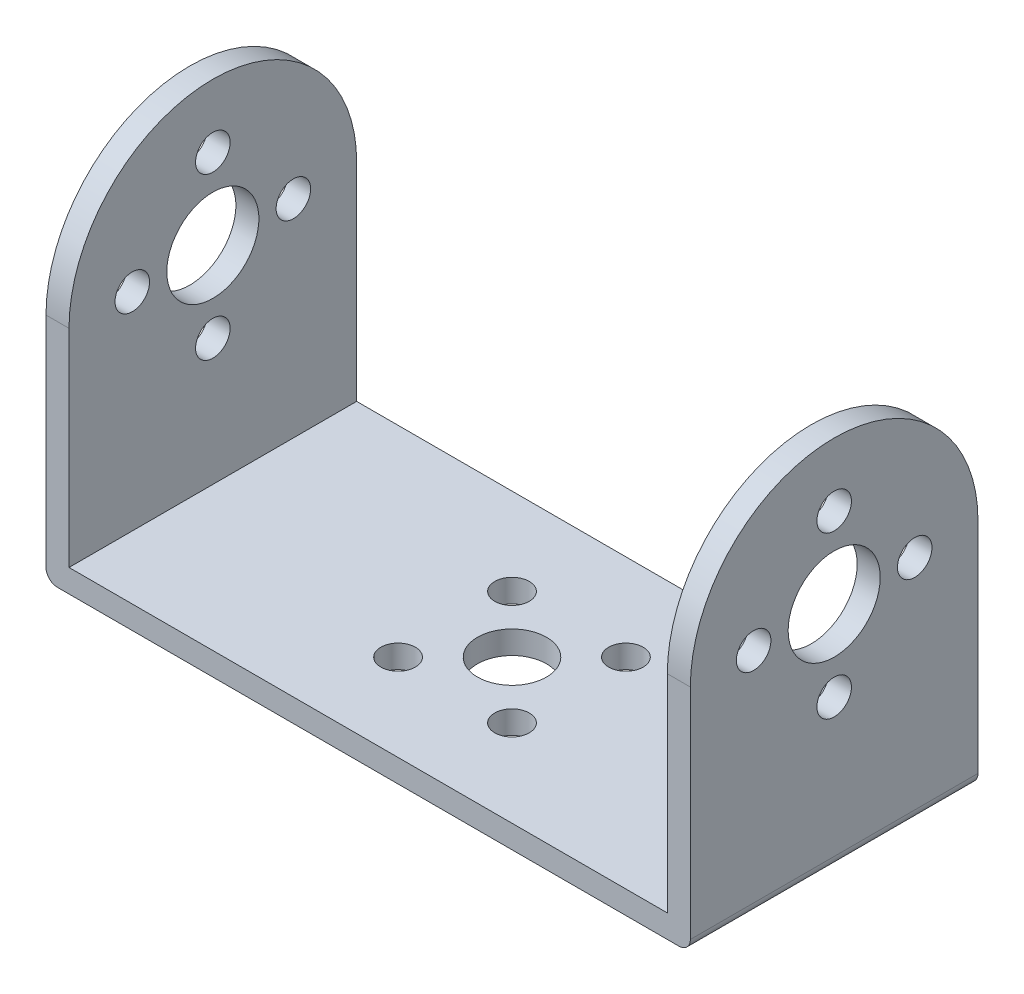
ISO-10303-21;
HEADER;
FILE_DESCRIPTION(('STEP AP214'),'2;1');
FILE_NAME('part.step','',(''),(''),'','','');
FILE_SCHEMA(('AUTOMOTIVE_DESIGN { 1 0 10303 214 1 1 1 1 }'));
ENDSEC;
DATA;
#1=APPLICATION_CONTEXT('core data for automotive mechanical design processes');
#2=APPLICATION_PROTOCOL_DEFINITION('international standard','automotive_design',2000,#1);
#3=PRODUCT_CONTEXT('',#1,'mechanical');
#4=PRODUCT('Part','Part','',(#3));
#5=PRODUCT_RELATED_PRODUCT_CATEGORY('part','',(#4));
#6=PRODUCT_DEFINITION_FORMATION('','',#4);
#7=PRODUCT_DEFINITION_CONTEXT('part definition',#1,'design');
#8=PRODUCT_DEFINITION('design','',#6,#7);
#9=PRODUCT_DEFINITION_SHAPE('','',#8);
#10=(LENGTH_UNIT() NAMED_UNIT(*) SI_UNIT(.MILLI.,.METRE.));
#11=(NAMED_UNIT(*) PLANE_ANGLE_UNIT() SI_UNIT($,.RADIAN.));
#12=(NAMED_UNIT(*) SI_UNIT($,.STERADIAN.) SOLID_ANGLE_UNIT());
#13=UNCERTAINTY_MEASURE_WITH_UNIT(LENGTH_MEASURE(1.E-05),#10,'distance_accuracy_value','');
#14=(GEOMETRIC_REPRESENTATION_CONTEXT(3) GLOBAL_UNCERTAINTY_ASSIGNED_CONTEXT((#13)) GLOBAL_UNIT_ASSIGNED_CONTEXT((#10,
#11,#12)) REPRESENTATION_CONTEXT('',''));
#15=CARTESIAN_POINT('',(0.,0.,0.));
#16=DIRECTION('',(0.,0.,1.));
#17=DIRECTION('',(1.,0.,0.));
#18=AXIS2_PLACEMENT_3D('',#15,#16,#17);
#19=CARTESIAN_POINT('',(0.,2.,0.));
#20=DIRECTION('',(0.,1.,0.));
#21=DIRECTION('',(0.,0.,1.));
#22=AXIS2_PLACEMENT_3D('',#19,#20,#21);
#23=PLANE('',#22);
#24=CARTESIAN_POINT('',(12.6040027874548,2.,-5.68113044702918));
#25=DIRECTION('',(0.,1.,0.));
#26=DIRECTION('',(0.,0.,1.));
#27=AXIS2_PLACEMENT_3D('',#24,#25,#26);
#28=CIRCLE('',#27,1.5);
#29=CARTESIAN_POINT('',(12.6040027874548,2.,-4.18113044702918));
#30=VERTEX_POINT('',#29);
#31=EDGE_CURVE('E241',#30,#30,#28,.T.);
#32=ORIENTED_EDGE('',*,*,#31,.F.);
#33=EDGE_LOOP('',(#32));
#34=FACE_BOUND('',#33,.T.);
#35=CARTESIAN_POINT('',(2.70450785084305,2.,-5.68113044702918));
#36=DIRECTION('',(0.,1.,0.));
#37=DIRECTION('',(0.,0.,1.));
#38=AXIS2_PLACEMENT_3D('',#35,#36,#37);
#39=CIRCLE('',#38,1.5);
#40=CARTESIAN_POINT('',(2.70450785084305,2.,-4.18113044702918));
#41=VERTEX_POINT('',#40);
#42=EDGE_CURVE('E249',#41,#41,#39,.T.);
#43=ORIENTED_EDGE('',*,*,#42,.F.);
#44=EDGE_LOOP('',(#43));
#45=FACE_BOUND('',#44,.T.);
#46=CARTESIAN_POINT('',(12.6040027874548,2.,4.21836448958237));
#47=DIRECTION('',(0.,1.,0.));
#48=DIRECTION('',(0.,0.,1.));
#49=AXIS2_PLACEMENT_3D('',#46,#47,#48);
#50=CIRCLE('',#49,1.5);
#51=CARTESIAN_POINT('',(12.6040027874548,2.,5.71836448958237));
#52=VERTEX_POINT('',#51);
#53=EDGE_CURVE('E257',#52,#52,#50,.T.);
#54=ORIENTED_EDGE('',*,*,#53,.F.);
#55=EDGE_LOOP('',(#54));
#56=FACE_BOUND('',#55,.T.);
#57=CARTESIAN_POINT('',(2.70450785084305,2.,4.21836448958237));
#58=DIRECTION('',(0.,1.,0.));
#59=DIRECTION('',(0.,0.,1.));
#60=AXIS2_PLACEMENT_3D('',#57,#58,#59);
#61=CIRCLE('',#60,1.5);
#62=CARTESIAN_POINT('',(2.70450785084305,2.,5.71836448958237));
#63=VERTEX_POINT('',#62);
#64=EDGE_CURVE('E232',#63,#63,#61,.T.);
#65=ORIENTED_EDGE('',*,*,#64,.F.);
#66=EDGE_LOOP('',(#65));
#67=FACE_BOUND('',#66,.T.);
#68=CARTESIAN_POINT('',(7.65425531914894,2.,-0.731382978723405));
#69=DIRECTION('',(0.,1.,0.));
#70=DIRECTION('',(0.,0.,1.));
#71=AXIS2_PLACEMENT_3D('',#68,#69,#70);
#72=CIRCLE('',#71,3.);
#73=CARTESIAN_POINT('',(7.65425531914894,2.,2.2686170212766));
#74=VERTEX_POINT('',#73);
#75=EDGE_CURVE('E240',#74,#74,#72,.T.);
#76=ORIENTED_EDGE('',*,*,#75,.F.);
#77=EDGE_LOOP('',(#76));
#78=FACE_BOUND('',#77,.T.);
#79=DIRECTION('',(1.,0.,0.));
#80=VECTOR('',#79,1.);
#81=CARTESIAN_POINT('',(-20.3457446808511,2.,11.7686170212766));
#82=LINE('',#81,#80);
#83=CARTESIAN_POINT('',(-18.3457446808511,2.,11.7686170212766));
#84=VERTEX_POINT('',#83);
#85=CARTESIAN_POINT('',(33.6542553191489,2.,11.7686170212766));
#86=VERTEX_POINT('',#85);
#87=EDGE_CURVE('E276',#84,#86,#82,.T.);
#88=ORIENTED_EDGE('',*,*,#87,.T.);
#89=DIRECTION('',(0.,0.,1.));
#90=VECTOR('',#89,1.);
#91=CARTESIAN_POINT('',(33.6542553191489,2.,-13.2313829787234));
#92=LINE('',#91,#90);
#93=CARTESIAN_POINT('',(33.6542553191489,2.,-13.2313829787234));
#94=VERTEX_POINT('',#93);
#95=EDGE_CURVE('E132',#94,#86,#92,.T.);
#96=ORIENTED_EDGE('',*,*,#95,.F.);
#97=DIRECTION('',(-1.,0.,0.));
#98=VECTOR('',#97,1.);
#99=CARTESIAN_POINT('',(-20.3457446808511,2.,-13.2313829787234));
#100=LINE('',#99,#98);
#101=CARTESIAN_POINT('',(-18.3457446808511,2.,-13.2313829787234));
#102=VERTEX_POINT('',#101);
#103=EDGE_CURVE('E279',#94,#102,#100,.T.);
#104=ORIENTED_EDGE('',*,*,#103,.T.);
#105=DIRECTION('',(0.,0.,1.));
#106=VECTOR('',#105,1.);
#107=CARTESIAN_POINT('',(-18.3457446808511,2.,-13.2313829787234));
#108=LINE('',#107,#106);
#109=EDGE_CURVE('E216',#102,#84,#108,.T.);
#110=ORIENTED_EDGE('',*,*,#109,.T.);
#111=EDGE_LOOP('',(#88,#96,#104,#110));
#112=FACE_BOUND('',#111,.T.);
#113=ADVANCED_FACE('F43',(#34,#45,#56,#67,#78,#112),#23,.T.);
#114=CARTESIAN_POINT('',(-20.3457446808511,2.,-13.2313829787234));
#115=DIRECTION('',(1.,0.,0.));
#116=DIRECTION('',(0.,0.,-1.));
#117=AXIS2_PLACEMENT_3D('',#114,#115,#116);
#118=PLANE('',#117);
#119=CARTESIAN_POINT('',(-20.3457446808511,20.,-7.73138297872341));
#120=DIRECTION('',(-1.,0.,0.));
#121=DIRECTION('',(0.,0.,1.));
#122=AXIS2_PLACEMENT_3D('',#119,#120,#121);
#123=CIRCLE('',#122,1.5);
#124=CARTESIAN_POINT('',(-20.3457446808511,20.,-6.23138297872341));
#125=VERTEX_POINT('',#124);
#126=EDGE_CURVE('E166',#125,#125,#123,.T.);
#127=ORIENTED_EDGE('',*,*,#126,.F.);
#128=EDGE_LOOP('',(#127));
#129=FACE_BOUND('',#128,.T.);
#130=CARTESIAN_POINT('',(-20.3457446808511,13.,-0.731382978723408));
#131=DIRECTION('',(-1.,0.,0.));
#132=DIRECTION('',(0.,0.,1.));
#133=AXIS2_PLACEMENT_3D('',#130,#131,#132);
#134=CIRCLE('',#133,1.5);
#135=CARTESIAN_POINT('',(-20.3457446808511,13.,0.76861702127659));
#136=VERTEX_POINT('',#135);
#137=EDGE_CURVE('E168',#136,#136,#134,.T.);
#138=ORIENTED_EDGE('',*,*,#137,.F.);
#139=EDGE_LOOP('',(#138));
#140=FACE_BOUND('',#139,.T.);
#141=CARTESIAN_POINT('',(-20.3457446808511,20.,6.26861702127659));
#142=DIRECTION('',(-1.,0.,0.));
#143=DIRECTION('',(0.,0.,1.));
#144=AXIS2_PLACEMENT_3D('',#141,#142,#143);
#145=CIRCLE('',#144,1.5);
#146=CARTESIAN_POINT('',(-20.3457446808511,20.,7.76861702127659));
#147=VERTEX_POINT('',#146);
#148=EDGE_CURVE('E177',#147,#147,#145,.T.);
#149=ORIENTED_EDGE('',*,*,#148,.F.);
#150=EDGE_LOOP('',(#149));
#151=FACE_BOUND('',#150,.T.);
#152=CARTESIAN_POINT('',(-20.3457446808511,27.,-0.731382978723409));
#153=DIRECTION('',(-1.,0.,0.));
#154=DIRECTION('',(0.,0.,1.));
#155=AXIS2_PLACEMENT_3D('',#152,#153,#154);
#156=CIRCLE('',#155,1.5);
#157=CARTESIAN_POINT('',(-20.3457446808511,27.,0.768617021276593));
#158=VERTEX_POINT('',#157);
#159=EDGE_CURVE('E184',#158,#158,#156,.T.);
#160=ORIENTED_EDGE('',*,*,#159,.F.);
#161=EDGE_LOOP('',(#160));
#162=FACE_BOUND('',#161,.T.);
#163=CARTESIAN_POINT('',(-20.3457446808511,20.,-0.731382978723409));
#164=DIRECTION('',(-1.,0.,0.));
#165=DIRECTION('',(0.,0.,1.));
#166=AXIS2_PLACEMENT_3D('',#163,#164,#165);
#167=CIRCLE('',#166,4.);
#168=CARTESIAN_POINT('',(-20.3457446808511,20.,3.26861702127659));
#169=VERTEX_POINT('',#168);
#170=EDGE_CURVE('E193',#169,#169,#167,.T.);
#171=ORIENTED_EDGE('',*,*,#170,.F.);
#172=EDGE_LOOP('',(#171));
#173=FACE_BOUND('',#172,.T.);
#174=DIRECTION('',(0.,-1.,0.));
#175=VECTOR('',#174,1.);
#176=CARTESIAN_POINT('',(-20.3457446808511,2.,-13.2313829787234));
#177=LINE('',#176,#175);
#178=CARTESIAN_POINT('',(-20.3457446808511,20.,-13.2313829787234));
#179=VERTEX_POINT('',#178);
#180=CARTESIAN_POINT('',(-20.3457446808511,1.,-13.2313829787234));
#181=VERTEX_POINT('',#180);
#182=EDGE_CURVE('E283',#179,#181,#177,.T.);
#183=ORIENTED_EDGE('',*,*,#182,.T.);
#184=DIRECTION('',(0.,0.,1.));
#185=VECTOR('',#184,1.);
#186=CARTESIAN_POINT('',(-20.3457446808511,1.,-13.2313829787234));
#187=LINE('',#186,#185);
#188=CARTESIAN_POINT('',(-20.3457446808511,1.,11.7686170212766));
#189=VERTEX_POINT('',#188);
#190=EDGE_CURVE('E11',#181,#189,#187,.T.);
#191=ORIENTED_EDGE('',*,*,#190,.T.);
#192=DIRECTION('',(0.,-1.,0.));
#193=VECTOR('',#192,1.);
#194=CARTESIAN_POINT('',(-20.3457446808511,2.,11.7686170212766));
#195=LINE('',#194,#193);
#196=CARTESIAN_POINT('',(-20.3457446808511,20.,11.7686170212766));
#197=VERTEX_POINT('',#196);
#198=EDGE_CURVE('E298',#197,#189,#195,.T.);
#199=ORIENTED_EDGE('',*,*,#198,.F.);
#200=CARTESIAN_POINT('',(-20.3457446808511,20.,-0.731382978723409));
#201=DIRECTION('',(-1.,0.,0.));
#202=DIRECTION('',(0.,0.,1.));
#203=AXIS2_PLACEMENT_3D('',#200,#201,#202);
#204=CIRCLE('',#203,12.5);
#205=EDGE_CURVE('E207',#197,#179,#204,.T.);
#206=ORIENTED_EDGE('',*,*,#205,.T.);
#207=EDGE_LOOP('',(#183,#191,#199,#206));
#208=FACE_BOUND('',#207,.T.);
#209=ADVANCED_FACE('F330',(#129,#140,#151,#162,#173,#208),#118,.F.);
#210=CARTESIAN_POINT('',(-20.3457446808511,2.,11.7686170212766));
#211=DIRECTION('',(0.,0.,-1.));
#212=DIRECTION('',(-1.,0.,0.));
#213=AXIS2_PLACEMENT_3D('',#210,#211,#212);
#214=PLANE('',#213);
#215=DIRECTION('',(1.,0.,0.));
#216=VECTOR('',#215,1.);
#217=CARTESIAN_POINT('',(-20.3457446808511,0.,11.7686170212766));
#218=LINE('',#217,#216);
#219=CARTESIAN_POINT('',(-19.3457446808511,0.,11.7686170212766));
#220=VERTEX_POINT('',#219);
#221=CARTESIAN_POINT('',(34.6542553191489,0.,11.7686170212766));
#222=VERTEX_POINT('',#221);
#223=EDGE_CURVE('E272',#220,#222,#218,.T.);
#224=ORIENTED_EDGE('',*,*,#223,.T.);
#225=CARTESIAN_POINT('',(34.6542553191489,1.,11.7686170212766));
#226=DIRECTION('',(0.,0.,-1.));
#227=DIRECTION('',(-1.,0.,0.));
#228=AXIS2_PLACEMENT_3D('',#225,#226,#227);
#229=CIRCLE('',#228,1.);
#230=CARTESIAN_POINT('',(35.6542553191489,1.,11.7686170212766));
#231=VERTEX_POINT('',#230);
#232=EDGE_CURVE('E52',#222,#231,#229,.F.);
#233=ORIENTED_EDGE('',*,*,#232,.T.);
#234=DIRECTION('',(0.,-1.,0.));
#235=VECTOR('',#234,1.);
#236=CARTESIAN_POINT('',(35.6542553191489,2.,11.7686170212766));
#237=LINE('',#236,#235);
#238=CARTESIAN_POINT('',(35.6542553191489,20.,11.7686170212766));
#239=VERTEX_POINT('',#238);
#240=EDGE_CURVE('E141',#239,#231,#237,.T.);
#241=ORIENTED_EDGE('',*,*,#240,.F.);
#242=DIRECTION('',(1.,0.,0.));
#243=VECTOR('',#242,1.);
#244=CARTESIAN_POINT('',(33.6542553191489,20.,11.7686170212766));
#245=LINE('',#244,#243);
#246=CARTESIAN_POINT('',(33.6542553191489,20.,11.7686170212766));
#247=VERTEX_POINT('',#246);
#248=EDGE_CURVE('E138',#247,#239,#245,.T.);
#249=ORIENTED_EDGE('',*,*,#248,.F.);
#250=DIRECTION('',(0.,1.,0.));
#251=VECTOR('',#250,1.);
#252=CARTESIAN_POINT('',(33.6542553191489,20.,11.7686170212766));
#253=LINE('',#252,#251);
#254=EDGE_CURVE('E124',#86,#247,#253,.T.);
#255=ORIENTED_EDGE('',*,*,#254,.F.);
#256=ORIENTED_EDGE('',*,*,#87,.F.);
#257=DIRECTION('',(0.,1.,0.));
#258=VECTOR('',#257,1.);
#259=CARTESIAN_POINT('',(-18.3457446808511,20.,11.7686170212766));
#260=LINE('',#259,#258);
#261=CARTESIAN_POINT('',(-18.3457446808511,20.,11.7686170212766));
#262=VERTEX_POINT('',#261);
#263=EDGE_CURVE('E220',#84,#262,#260,.T.);
#264=ORIENTED_EDGE('',*,*,#263,.T.);
#265=DIRECTION('',(-1.,0.,0.));
#266=VECTOR('',#265,1.);
#267=CARTESIAN_POINT('',(-18.3457446808511,20.,11.7686170212766));
#268=LINE('',#267,#266);
#269=EDGE_CURVE('E228',#262,#197,#268,.T.);
#270=ORIENTED_EDGE('',*,*,#269,.T.);
#271=ORIENTED_EDGE('',*,*,#198,.T.);
#272=CARTESIAN_POINT('',(-19.3457446808511,1.,11.7686170212766));
#273=DIRECTION('',(0.,0.,-1.));
#274=DIRECTION('',(-1.,0.,0.));
#275=AXIS2_PLACEMENT_3D('',#272,#273,#274);
#276=CIRCLE('',#275,1.);
#277=EDGE_CURVE('E59',#189,#220,#276,.F.);
#278=ORIENTED_EDGE('',*,*,#277,.T.);
#279=EDGE_LOOP('',(#224,#233,#241,#249,#255,#256,#264,#270,#271,#278));
#280=FACE_BOUND('',#279,.T.);
#281=ADVANCED_FACE('F139',(#280),#214,.F.);
#282=CARTESIAN_POINT('',(35.6542553191489,2.,-13.2313829787234));
#283=DIRECTION('',(-1.,0.,0.));
#284=DIRECTION('',(0.,0.,1.));
#285=AXIS2_PLACEMENT_3D('',#282,#283,#284);
#286=PLANE('',#285);
#287=CARTESIAN_POINT('',(35.6542553191489,20.,-7.73138297872341));
#288=DIRECTION('',(-1.,0.,0.));
#289=DIRECTION('',(0.,0.,1.));
#290=AXIS2_PLACEMENT_3D('',#287,#288,#289);
#291=CIRCLE('',#290,1.5);
#292=CARTESIAN_POINT('',(35.6542553191489,20.,-6.23138297872341));
#293=VERTEX_POINT('',#292);
#294=EDGE_CURVE('E741',#293,#293,#291,.T.);
#295=ORIENTED_EDGE('',*,*,#294,.T.);
#296=EDGE_LOOP('',(#295));
#297=FACE_BOUND('',#296,.T.);
#298=CARTESIAN_POINT('',(35.6542553191489,13.,-0.731382978723408));
#299=DIRECTION('',(-1.,0.,0.));
#300=DIRECTION('',(0.,0.,1.));
#301=AXIS2_PLACEMENT_3D('',#298,#299,#300);
#302=CIRCLE('',#301,1.5);
#303=CARTESIAN_POINT('',(35.6542553191489,13.,0.76861702127659));
#304=VERTEX_POINT('',#303);
#305=EDGE_CURVE('E734',#304,#304,#302,.T.);
#306=ORIENTED_EDGE('',*,*,#305,.T.);
#307=EDGE_LOOP('',(#306));
#308=FACE_BOUND('',#307,.T.);
#309=CARTESIAN_POINT('',(35.6542553191489,20.,6.26861702127659));
#310=DIRECTION('',(-1.,0.,0.));
#311=DIRECTION('',(0.,0.,1.));
#312=AXIS2_PLACEMENT_3D('',#309,#310,#311);
#313=CIRCLE('',#312,1.5);
#314=CARTESIAN_POINT('',(35.6542553191489,20.,7.76861702127659));
#315=VERTEX_POINT('',#314);
#316=EDGE_CURVE('E725',#315,#315,#313,.T.);
#317=ORIENTED_EDGE('',*,*,#316,.T.);
#318=EDGE_LOOP('',(#317));
#319=FACE_BOUND('',#318,.T.);
#320=CARTESIAN_POINT('',(35.6542553191489,27.,-0.731382978723409));
#321=DIRECTION('',(-1.,0.,0.));
#322=DIRECTION('',(0.,0.,1.));
#323=AXIS2_PLACEMENT_3D('',#320,#321,#322);
#324=CIRCLE('',#323,1.5);
#325=CARTESIAN_POINT('',(35.6542553191489,27.,0.768617021276593));
#326=VERTEX_POINT('',#325);
#327=EDGE_CURVE('E716',#326,#326,#324,.T.);
#328=ORIENTED_EDGE('',*,*,#327,.T.);
#329=EDGE_LOOP('',(#328));
#330=FACE_BOUND('',#329,.T.);
#331=CARTESIAN_POINT('',(35.6542553191489,20.,-0.731382978723409));
#332=DIRECTION('',(-1.,0.,0.));
#333=DIRECTION('',(0.,0.,1.));
#334=AXIS2_PLACEMENT_3D('',#331,#332,#333);
#335=CIRCLE('',#334,4.);
#336=CARTESIAN_POINT('',(35.6542553191489,20.,3.26861702127659));
#337=VERTEX_POINT('',#336);
#338=EDGE_CURVE('E155',#337,#337,#335,.T.);
#339=ORIENTED_EDGE('',*,*,#338,.T.);
#340=EDGE_LOOP('',(#339));
#341=FACE_BOUND('',#340,.T.);
#342=ORIENTED_EDGE('',*,*,#240,.T.);
#343=DIRECTION('',(0.,0.,-1.));
#344=VECTOR('',#343,1.);
#345=CARTESIAN_POINT('',(35.6542553191489,1.,-13.2313829787234));
#346=LINE('',#345,#344);
#347=CARTESIAN_POINT('',(35.6542553191489,1.,-13.2313829787234));
#348=VERTEX_POINT('',#347);
#349=EDGE_CURVE('E302',#231,#348,#346,.T.);
#350=ORIENTED_EDGE('',*,*,#349,.T.);
#351=DIRECTION('',(0.,-1.,0.));
#352=VECTOR('',#351,1.);
#353=CARTESIAN_POINT('',(35.6542553191489,2.,-13.2313829787234));
#354=LINE('',#353,#352);
#355=CARTESIAN_POINT('',(35.6542553191489,20.,-13.2313829787234));
#356=VERTEX_POINT('',#355);
#357=EDGE_CURVE('E292',#356,#348,#354,.T.);
#358=ORIENTED_EDGE('',*,*,#357,.F.);
#359=CARTESIAN_POINT('',(35.6542553191489,20.,-0.731382978723409));
#360=DIRECTION('',(-1.,0.,0.));
#361=DIRECTION('',(0.,0.,1.));
#362=AXIS2_PLACEMENT_3D('',#359,#360,#361);
#363=CIRCLE('',#362,12.5);
#364=EDGE_CURVE('E152',#239,#356,#363,.T.);
#365=ORIENTED_EDGE('',*,*,#364,.F.);
#366=EDGE_LOOP('',(#342,#350,#358,#365));
#367=FACE_BOUND('',#366,.T.);
#368=ADVANCED_FACE('F323',(#297,#308,#319,#330,#341,#367),#286,.F.);
#369=CARTESIAN_POINT('',(-20.3457446808511,2.,-13.2313829787234));
#370=DIRECTION('',(0.,0.,1.));
#371=DIRECTION('',(1.,0.,0.));
#372=AXIS2_PLACEMENT_3D('',#369,#370,#371);
#373=PLANE('',#372);
#374=ORIENTED_EDGE('',*,*,#357,.T.);
#375=CARTESIAN_POINT('',(34.6542553191489,1.,-13.2313829787234));
#376=DIRECTION('',(0.,0.,1.));
#377=DIRECTION('',(1.,0.,0.));
#378=AXIS2_PLACEMENT_3D('',#375,#376,#377);
#379=CIRCLE('',#378,1.);
#380=CARTESIAN_POINT('',(34.6542553191489,0.,-13.2313829787234));
#381=VERTEX_POINT('',#380);
#382=EDGE_CURVE('E309',#348,#381,#379,.F.);
#383=ORIENTED_EDGE('',*,*,#382,.T.);
#384=DIRECTION('',(-1.,0.,0.));
#385=VECTOR('',#384,1.);
#386=CARTESIAN_POINT('',(-20.3457446808511,0.,-13.2313829787234));
#387=LINE('',#386,#385);
#388=CARTESIAN_POINT('',(-19.3457446808511,0.,-13.2313829787234));
#389=VERTEX_POINT('',#388);
#390=EDGE_CURVE('E280',#381,#389,#387,.T.);
#391=ORIENTED_EDGE('',*,*,#390,.T.);
#392=CARTESIAN_POINT('',(-19.3457446808511,1.,-13.2313829787234));
#393=DIRECTION('',(0.,0.,1.));
#394=DIRECTION('',(1.,0.,0.));
#395=AXIS2_PLACEMENT_3D('',#392,#393,#394);
#396=CIRCLE('',#395,1.);
#397=EDGE_CURVE('E306',#389,#181,#396,.F.);
#398=ORIENTED_EDGE('',*,*,#397,.T.);
#399=ORIENTED_EDGE('',*,*,#182,.F.);
#400=DIRECTION('',(-1.,0.,0.));
#401=VECTOR('',#400,1.);
#402=CARTESIAN_POINT('',(-18.3457446808511,20.,-13.2313829787234));
#403=LINE('',#402,#401);
#404=CARTESIAN_POINT('',(-18.3457446808511,20.,-13.2313829787234));
#405=VERTEX_POINT('',#404);
#406=EDGE_CURVE('E224',#405,#179,#403,.T.);
#407=ORIENTED_EDGE('',*,*,#406,.F.);
#408=DIRECTION('',(0.,-1.,0.));
#409=VECTOR('',#408,1.);
#410=CARTESIAN_POINT('',(-18.3457446808511,20.,-13.2313829787234));
#411=LINE('',#410,#409);
#412=EDGE_CURVE('E212',#405,#102,#411,.T.);
#413=ORIENTED_EDGE('',*,*,#412,.T.);
#414=ORIENTED_EDGE('',*,*,#103,.F.);
#415=DIRECTION('',(0.,-1.,0.));
#416=VECTOR('',#415,1.);
#417=CARTESIAN_POINT('',(33.6542553191489,20.,-13.2313829787234));
#418=LINE('',#417,#416);
#419=CARTESIAN_POINT('',(33.6542553191489,20.,-13.2313829787234));
#420=VERTEX_POINT('',#419);
#421=EDGE_CURVE('E147',#420,#94,#418,.T.);
#422=ORIENTED_EDGE('',*,*,#421,.F.);
#423=DIRECTION('',(1.,0.,0.));
#424=VECTOR('',#423,1.);
#425=CARTESIAN_POINT('',(33.6542553191489,20.,-13.2313829787234));
#426=LINE('',#425,#424);
#427=EDGE_CURVE('E146',#420,#356,#426,.T.);
#428=ORIENTED_EDGE('',*,*,#427,.T.);
#429=EDGE_LOOP('',(#374,#383,#391,#398,#399,#407,#413,#414,#422,#428));
#430=FACE_BOUND('',#429,.T.);
#431=ADVANCED_FACE('F326',(#430),#373,.F.);
#432=CARTESIAN_POINT('',(0.,0.,0.));
#433=DIRECTION('',(0.,1.,0.));
#434=DIRECTION('',(0.,0.,1.));
#435=AXIS2_PLACEMENT_3D('',#432,#433,#434);
#436=PLANE('',#435);
#437=CARTESIAN_POINT('',(12.6040027874548,0.,-5.68113044702918));
#438=DIRECTION('',(0.,1.,0.));
#439=DIRECTION('',(0.,0.,1.));
#440=AXIS2_PLACEMENT_3D('',#437,#438,#439);
#441=CIRCLE('',#440,1.5);
#442=CARTESIAN_POINT('',(12.6040027874548,0.,-4.18113044702918));
#443=VERTEX_POINT('',#442);
#444=EDGE_CURVE('E236',#443,#443,#441,.T.);
#445=ORIENTED_EDGE('',*,*,#444,.T.);
#446=EDGE_LOOP('',(#445));
#447=FACE_BOUND('',#446,.T.);
#448=CARTESIAN_POINT('',(2.70450785084305,0.,-5.68113044702918));
#449=DIRECTION('',(0.,1.,0.));
#450=DIRECTION('',(0.,0.,1.));
#451=AXIS2_PLACEMENT_3D('',#448,#449,#450);
#452=CIRCLE('',#451,1.5);
#453=CARTESIAN_POINT('',(2.70450785084305,0.,-4.18113044702918));
#454=VERTEX_POINT('',#453);
#455=EDGE_CURVE('E245',#454,#454,#452,.T.);
#456=ORIENTED_EDGE('',*,*,#455,.T.);
#457=EDGE_LOOP('',(#456));
#458=FACE_BOUND('',#457,.T.);
#459=CARTESIAN_POINT('',(12.6040027874548,0.,4.21836448958237));
#460=DIRECTION('',(0.,1.,0.));
#461=DIRECTION('',(0.,0.,1.));
#462=AXIS2_PLACEMENT_3D('',#459,#460,#461);
#463=CIRCLE('',#462,1.5);
#464=CARTESIAN_POINT('',(12.6040027874548,0.,5.71836448958237));
#465=VERTEX_POINT('',#464);
#466=EDGE_CURVE('E253',#465,#465,#463,.T.);
#467=ORIENTED_EDGE('',*,*,#466,.T.);
#468=EDGE_LOOP('',(#467));
#469=FACE_BOUND('',#468,.T.);
#470=CARTESIAN_POINT('',(2.70450785084305,0.,4.21836448958237));
#471=DIRECTION('',(0.,1.,0.));
#472=DIRECTION('',(0.,0.,1.));
#473=AXIS2_PLACEMENT_3D('',#470,#471,#472);
#474=CIRCLE('',#473,1.5);
#475=CARTESIAN_POINT('',(2.70450785084305,0.,5.71836448958237));
#476=VERTEX_POINT('',#475);
#477=EDGE_CURVE('E261',#476,#476,#474,.T.);
#478=ORIENTED_EDGE('',*,*,#477,.T.);
#479=EDGE_LOOP('',(#478));
#480=FACE_BOUND('',#479,.T.);
#481=CARTESIAN_POINT('',(7.65425531914894,0.,-0.731382978723405));
#482=DIRECTION('',(0.,1.,0.));
#483=DIRECTION('',(0.,0.,1.));
#484=AXIS2_PLACEMENT_3D('',#481,#482,#483);
#485=CIRCLE('',#484,3.);
#486=CARTESIAN_POINT('',(7.65425531914894,0.,2.2686170212766));
#487=VERTEX_POINT('',#486);
#488=EDGE_CURVE('E268',#487,#487,#485,.T.);
#489=ORIENTED_EDGE('',*,*,#488,.T.);
#490=EDGE_LOOP('',(#489));
#491=FACE_BOUND('',#490,.T.);
#492=ORIENTED_EDGE('',*,*,#390,.F.);
#493=DIRECTION('',(0.,0.,-1.));
#494=VECTOR('',#493,1.);
#495=CARTESIAN_POINT('',(34.6542553191489,0.,0.));
#496=LINE('',#495,#494);
#497=EDGE_CURVE('E66',#381,#222,#496,.F.);
#498=ORIENTED_EDGE('',*,*,#497,.T.);
#499=ORIENTED_EDGE('',*,*,#223,.F.);
#500=DIRECTION('',(0.,0.,1.));
#501=VECTOR('',#500,1.);
#502=CARTESIAN_POINT('',(-19.3457446808511,0.,0.));
#503=LINE('',#502,#501);
#504=EDGE_CURVE('E312',#220,#389,#503,.F.);
#505=ORIENTED_EDGE('',*,*,#504,.T.);
#506=EDGE_LOOP('',(#492,#498,#499,#505));
#507=FACE_BOUND('',#506,.T.);
#508=ADVANCED_FACE('F328',(#447,#458,#469,#480,#491,#507),#436,.F.);
#509=CARTESIAN_POINT('',(7.65425531914894,0.,-0.731382978723405));
#510=DIRECTION('',(0.,1.,0.));
#511=DIRECTION('',(0.,0.,1.));
#512=AXIS2_PLACEMENT_3D('',#509,#510,#511);
#513=CYLINDRICAL_SURFACE('',#512,3.);
#514=ORIENTED_EDGE('',*,*,#488,.F.);
#515=EDGE_LOOP('',(#514));
#516=FACE_BOUND('',#515,.T.);
#517=ORIENTED_EDGE('',*,*,#75,.T.);
#518=EDGE_LOOP('',(#517));
#519=FACE_BOUND('',#518,.T.);
#520=ADVANCED_FACE('F352',(#516,#519),#513,.F.);
#521=CARTESIAN_POINT('',(2.70450785084305,0.,4.21836448958237));
#522=DIRECTION('',(0.,1.,0.));
#523=DIRECTION('',(0.,0.,1.));
#524=AXIS2_PLACEMENT_3D('',#521,#522,#523);
#525=CYLINDRICAL_SURFACE('',#524,1.5);
#526=ORIENTED_EDGE('',*,*,#477,.F.);
#527=EDGE_LOOP('',(#526));
#528=FACE_BOUND('',#527,.T.);
#529=ORIENTED_EDGE('',*,*,#64,.T.);
#530=EDGE_LOOP('',(#529));
#531=FACE_BOUND('',#530,.T.);
#532=ADVANCED_FACE('F432',(#528,#531),#525,.F.);
#533=CARTESIAN_POINT('',(12.6040027874548,0.,4.21836448958237));
#534=DIRECTION('',(0.,1.,0.));
#535=DIRECTION('',(0.,0.,1.));
#536=AXIS2_PLACEMENT_3D('',#533,#534,#535);
#537=CYLINDRICAL_SURFACE('',#536,1.5);
#538=ORIENTED_EDGE('',*,*,#466,.F.);
#539=EDGE_LOOP('',(#538));
#540=FACE_BOUND('',#539,.T.);
#541=ORIENTED_EDGE('',*,*,#53,.T.);
#542=EDGE_LOOP('',(#541));
#543=FACE_BOUND('',#542,.T.);
#544=ADVANCED_FACE('F429',(#540,#543),#537,.F.);
#545=CARTESIAN_POINT('',(2.70450785084305,0.,-5.68113044702918));
#546=DIRECTION('',(0.,1.,0.));
#547=DIRECTION('',(0.,0.,1.));
#548=AXIS2_PLACEMENT_3D('',#545,#546,#547);
#549=CYLINDRICAL_SURFACE('',#548,1.5);
#550=ORIENTED_EDGE('',*,*,#455,.F.);
#551=EDGE_LOOP('',(#550));
#552=FACE_BOUND('',#551,.T.);
#553=ORIENTED_EDGE('',*,*,#42,.T.);
#554=EDGE_LOOP('',(#553));
#555=FACE_BOUND('',#554,.T.);
#556=ADVANCED_FACE('F425',(#552,#555),#549,.F.);
#557=CARTESIAN_POINT('',(12.6040027874548,0.,-5.68113044702918));
#558=DIRECTION('',(0.,1.,0.));
#559=DIRECTION('',(0.,0.,1.));
#560=AXIS2_PLACEMENT_3D('',#557,#558,#559);
#561=CYLINDRICAL_SURFACE('',#560,1.5);
#562=ORIENTED_EDGE('',*,*,#444,.F.);
#563=EDGE_LOOP('',(#562));
#564=FACE_BOUND('',#563,.T.);
#565=ORIENTED_EDGE('',*,*,#31,.T.);
#566=EDGE_LOOP('',(#565));
#567=FACE_BOUND('',#566,.T.);
#568=ADVANCED_FACE('F422',(#564,#567),#561,.F.);
#569=CARTESIAN_POINT('',(-18.3457446808511,20.,-0.731382978723409));
#570=DIRECTION('',(-1.,0.,0.));
#571=DIRECTION('',(0.,0.,1.));
#572=AXIS2_PLACEMENT_3D('',#569,#570,#571);
#573=CYLINDRICAL_SURFACE('',#572,12.5);
#574=ORIENTED_EDGE('',*,*,#205,.F.);
#575=ORIENTED_EDGE('',*,*,#269,.F.);
#576=CARTESIAN_POINT('',(-18.3457446808511,20.,-0.731382978723409));
#577=DIRECTION('',(-1.,0.,0.));
#578=DIRECTION('',(0.,0.,1.));
#579=AXIS2_PLACEMENT_3D('',#576,#577,#578);
#580=CIRCLE('',#579,12.5);
#581=EDGE_CURVE('E208',#262,#405,#580,.T.);
#582=ORIENTED_EDGE('',*,*,#581,.T.);
#583=ORIENTED_EDGE('',*,*,#406,.T.);
#584=EDGE_LOOP('',(#574,#575,#582,#583));
#585=FACE_BOUND('',#584,.T.);
#586=ADVANCED_FACE('F333',(#585),#573,.T.);
#587=CARTESIAN_POINT('',(-18.3457446808511,20.,-0.731382978723409));
#588=DIRECTION('',(-1.,0.,0.));
#589=DIRECTION('',(0.,0.,1.));
#590=AXIS2_PLACEMENT_3D('',#587,#588,#589);
#591=PLANE('',#590);
#592=CARTESIAN_POINT('',(-18.3457446808511,20.,-7.73138297872341));
#593=DIRECTION('',(-1.,0.,0.));
#594=DIRECTION('',(0.,0.,1.));
#595=AXIS2_PLACEMENT_3D('',#592,#593,#594);
#596=CIRCLE('',#595,1.5);
#597=CARTESIAN_POINT('',(-18.3457446808511,20.,-6.23138297872341));
#598=VERTEX_POINT('',#597);
#599=EDGE_CURVE('E173',#598,#598,#596,.F.);
#600=ORIENTED_EDGE('',*,*,#599,.F.);
#601=EDGE_LOOP('',(#600));
#602=FACE_BOUND('',#601,.T.);
#603=CARTESIAN_POINT('',(-18.3457446808511,13.,-0.731382978723408));
#604=DIRECTION('',(-1.,0.,0.));
#605=DIRECTION('',(0.,0.,1.));
#606=AXIS2_PLACEMENT_3D('',#603,#604,#605);
#607=CIRCLE('',#606,1.5);
#608=CARTESIAN_POINT('',(-18.3457446808511,13.,0.76861702127659));
#609=VERTEX_POINT('',#608);
#610=EDGE_CURVE('E172',#609,#609,#607,.F.);
#611=ORIENTED_EDGE('',*,*,#610,.F.);
#612=EDGE_LOOP('',(#611));
#613=FACE_BOUND('',#612,.T.);
#614=CARTESIAN_POINT('',(-18.3457446808511,20.,6.26861702127659));
#615=DIRECTION('',(-1.,0.,0.));
#616=DIRECTION('',(0.,0.,1.));
#617=AXIS2_PLACEMENT_3D('',#614,#615,#616);
#618=CIRCLE('',#617,1.5);
#619=CARTESIAN_POINT('',(-18.3457446808511,20.,7.76861702127659));
#620=VERTEX_POINT('',#619);
#621=EDGE_CURVE('E189',#620,#620,#618,.F.);
#622=ORIENTED_EDGE('',*,*,#621,.F.);
#623=EDGE_LOOP('',(#622));
#624=FACE_BOUND('',#623,.T.);
#625=CARTESIAN_POINT('',(-18.3457446808511,27.,-0.731382978723409));
#626=DIRECTION('',(-1.,0.,0.));
#627=DIRECTION('',(0.,0.,1.));
#628=AXIS2_PLACEMENT_3D('',#625,#626,#627);
#629=CIRCLE('',#628,1.5);
#630=CARTESIAN_POINT('',(-18.3457446808511,27.,0.768617021276593));
#631=VERTEX_POINT('',#630);
#632=EDGE_CURVE('E188',#631,#631,#629,.F.);
#633=ORIENTED_EDGE('',*,*,#632,.F.);
#634=EDGE_LOOP('',(#633));
#635=FACE_BOUND('',#634,.T.);
#636=CARTESIAN_POINT('',(-18.3457446808511,20.,-0.731382978723409));
#637=DIRECTION('',(-1.,0.,0.));
#638=DIRECTION('',(0.,0.,1.));
#639=AXIS2_PLACEMENT_3D('',#636,#637,#638);
#640=CIRCLE('',#639,4.);
#641=CARTESIAN_POINT('',(-18.3457446808511,20.,3.26861702127659));
#642=VERTEX_POINT('',#641);
#643=EDGE_CURVE('E203',#642,#642,#640,.F.);
#644=ORIENTED_EDGE('',*,*,#643,.F.);
#645=EDGE_LOOP('',(#644));
#646=FACE_BOUND('',#645,.T.);
#647=ORIENTED_EDGE('',*,*,#581,.F.);
#648=ORIENTED_EDGE('',*,*,#263,.F.);
#649=ORIENTED_EDGE('',*,*,#109,.F.);
#650=ORIENTED_EDGE('',*,*,#412,.F.);
#651=EDGE_LOOP('',(#647,#648,#649,#650));
#652=FACE_BOUND('',#651,.T.);
#653=ADVANCED_FACE('F338',(#602,#613,#624,#635,#646,#652),#591,.F.);
#654=CARTESIAN_POINT('',(35.6552553191489,20.,-0.731382978723409));
#655=DIRECTION('',(-1.,0.,0.));
#656=DIRECTION('',(0.,0.,1.));
#657=AXIS2_PLACEMENT_3D('',#654,#655,#656);
#658=CYLINDRICAL_SURFACE('',#657,4.);
#659=ORIENTED_EDGE('',*,*,#170,.T.);
#660=EDGE_LOOP('',(#659));
#661=FACE_BOUND('',#660,.T.);
#662=ORIENTED_EDGE('',*,*,#643,.T.);
#663=EDGE_LOOP('',(#662));
#664=FACE_BOUND('',#663,.T.);
#665=ADVANCED_FACE('F409',(#661,#664),#658,.F.);
#666=CARTESIAN_POINT('',(35.6552553191489,27.,-0.731382978723409));
#667=DIRECTION('',(-1.,0.,0.));
#668=DIRECTION('',(0.,0.,1.));
#669=AXIS2_PLACEMENT_3D('',#666,#667,#668);
#670=CYLINDRICAL_SURFACE('',#669,1.5);
#671=ORIENTED_EDGE('',*,*,#159,.T.);
#672=EDGE_LOOP('',(#671));
#673=FACE_BOUND('',#672,.T.);
#674=ORIENTED_EDGE('',*,*,#632,.T.);
#675=EDGE_LOOP('',(#674));
#676=FACE_BOUND('',#675,.T.);
#677=ADVANCED_FACE('F406',(#673,#676),#670,.F.);
#678=CARTESIAN_POINT('',(35.6552553191489,20.,6.26861702127659));
#679=DIRECTION('',(-1.,0.,0.));
#680=DIRECTION('',(0.,0.,1.));
#681=AXIS2_PLACEMENT_3D('',#678,#679,#680);
#682=CYLINDRICAL_SURFACE('',#681,1.5);
#683=ORIENTED_EDGE('',*,*,#148,.T.);
#684=EDGE_LOOP('',(#683));
#685=FACE_BOUND('',#684,.T.);
#686=ORIENTED_EDGE('',*,*,#621,.T.);
#687=EDGE_LOOP('',(#686));
#688=FACE_BOUND('',#687,.T.);
#689=ADVANCED_FACE('F401',(#685,#688),#682,.F.);
#690=CARTESIAN_POINT('',(35.6552553191489,13.,-0.731382978723408));
#691=DIRECTION('',(-1.,0.,0.));
#692=DIRECTION('',(0.,0.,1.));
#693=AXIS2_PLACEMENT_3D('',#690,#691,#692);
#694=CYLINDRICAL_SURFACE('',#693,1.5);
#695=ORIENTED_EDGE('',*,*,#137,.T.);
#696=EDGE_LOOP('',(#695));
#697=FACE_BOUND('',#696,.T.);
#698=ORIENTED_EDGE('',*,*,#610,.T.);
#699=EDGE_LOOP('',(#698));
#700=FACE_BOUND('',#699,.T.);
#701=ADVANCED_FACE('F398',(#697,#700),#694,.F.);
#702=CARTESIAN_POINT('',(35.6552553191489,20.,-7.73138297872341));
#703=DIRECTION('',(-1.,0.,0.));
#704=DIRECTION('',(0.,0.,1.));
#705=AXIS2_PLACEMENT_3D('',#702,#703,#704);
#706=CYLINDRICAL_SURFACE('',#705,1.5);
#707=ORIENTED_EDGE('',*,*,#126,.T.);
#708=EDGE_LOOP('',(#707));
#709=FACE_BOUND('',#708,.T.);
#710=ORIENTED_EDGE('',*,*,#599,.T.);
#711=EDGE_LOOP('',(#710));
#712=FACE_BOUND('',#711,.T.);
#713=ADVANCED_FACE('F397',(#709,#712),#706,.F.);
#714=CARTESIAN_POINT('',(33.6542553191489,20.,-0.731382978723409));
#715=DIRECTION('',(1.,0.,0.));
#716=DIRECTION('',(0.,0.,-1.));
#717=AXIS2_PLACEMENT_3D('',#714,#715,#716);
#718=CYLINDRICAL_SURFACE('',#717,12.5);
#719=ORIENTED_EDGE('',*,*,#364,.T.);
#720=ORIENTED_EDGE('',*,*,#427,.F.);
#721=CARTESIAN_POINT('',(33.6542553191489,20.,-0.731382978723409));
#722=DIRECTION('',(-1.,0.,0.));
#723=DIRECTION('',(0.,0.,1.));
#724=AXIS2_PLACEMENT_3D('',#721,#722,#723);
#725=CIRCLE('',#724,12.5);
#726=EDGE_CURVE('E129',#247,#420,#725,.T.);
#727=ORIENTED_EDGE('',*,*,#726,.F.);
#728=ORIENTED_EDGE('',*,*,#248,.T.);
#729=EDGE_LOOP('',(#719,#720,#727,#728));
#730=FACE_BOUND('',#729,.T.);
#731=ADVANCED_FACE('F149',(#730),#718,.T.);
#732=CARTESIAN_POINT('',(33.6542553191489,20.,-0.731382978723409));
#733=DIRECTION('',(1.,0.,0.));
#734=DIRECTION('',(0.,0.,1.));
#735=AXIS2_PLACEMENT_3D('',#732,#733,#734);
#736=PLANE('',#735);
#737=CARTESIAN_POINT('',(33.6542553191489,20.,-7.73138297872341));
#738=DIRECTION('',(1.,0.,0.));
#739=DIRECTION('',(0.,0.,-1.));
#740=AXIS2_PLACEMENT_3D('',#737,#738,#739);
#741=CIRCLE('',#740,1.5);
#742=CARTESIAN_POINT('',(33.6542553191489,20.,-9.23138297872341));
#743=VERTEX_POINT('',#742);
#744=EDGE_CURVE('E699',#743,#743,#741,.T.);
#745=ORIENTED_EDGE('',*,*,#744,.T.);
#746=EDGE_LOOP('',(#745));
#747=FACE_BOUND('',#746,.T.);
#748=CARTESIAN_POINT('',(33.6542553191489,13.,-0.731382978723408));
#749=DIRECTION('',(1.,0.,0.));
#750=DIRECTION('',(0.,0.,-1.));
#751=AXIS2_PLACEMENT_3D('',#748,#749,#750);
#752=CIRCLE('',#751,1.5);
#753=CARTESIAN_POINT('',(33.6542553191489,13.,-2.23138297872341));
#754=VERTEX_POINT('',#753);
#755=EDGE_CURVE('E703',#754,#754,#752,.T.);
#756=ORIENTED_EDGE('',*,*,#755,.T.);
#757=EDGE_LOOP('',(#756));
#758=FACE_BOUND('',#757,.T.);
#759=CARTESIAN_POINT('',(33.6542553191489,20.,6.26861702127659));
#760=DIRECTION('',(1.,0.,0.));
#761=DIRECTION('',(0.,0.,-1.));
#762=AXIS2_PLACEMENT_3D('',#759,#760,#761);
#763=CIRCLE('',#762,1.5);
#764=CARTESIAN_POINT('',(33.6542553191489,20.,4.76861702127658));
#765=VERTEX_POINT('',#764);
#766=EDGE_CURVE('E707',#765,#765,#763,.T.);
#767=ORIENTED_EDGE('',*,*,#766,.T.);
#768=EDGE_LOOP('',(#767));
#769=FACE_BOUND('',#768,.T.);
#770=CARTESIAN_POINT('',(33.6542553191489,27.,-0.731382978723409));
#771=DIRECTION('',(1.,0.,0.));
#772=DIRECTION('',(0.,0.,-1.));
#773=AXIS2_PLACEMENT_3D('',#770,#771,#772);
#774=CIRCLE('',#773,1.5);
#775=CARTESIAN_POINT('',(33.6542553191489,27.,-2.23138297872341));
#776=VERTEX_POINT('',#775);
#777=EDGE_CURVE('E711',#776,#776,#774,.T.);
#778=ORIENTED_EDGE('',*,*,#777,.T.);
#779=EDGE_LOOP('',(#778));
#780=FACE_BOUND('',#779,.T.);
#781=CARTESIAN_POINT('',(33.6542553191489,20.,-0.731382978723409));
#782=DIRECTION('',(1.,0.,0.));
#783=DIRECTION('',(0.,0.,-1.));
#784=AXIS2_PLACEMENT_3D('',#781,#782,#783);
#785=CIRCLE('',#784,4.);
#786=CARTESIAN_POINT('',(33.6542553191489,20.,-4.73138297872341));
#787=VERTEX_POINT('',#786);
#788=EDGE_CURVE('E158',#787,#787,#785,.T.);
#789=ORIENTED_EDGE('',*,*,#788,.T.);
#790=EDGE_LOOP('',(#789));
#791=FACE_BOUND('',#790,.T.);
#792=ORIENTED_EDGE('',*,*,#726,.T.);
#793=ORIENTED_EDGE('',*,*,#421,.T.);
#794=ORIENTED_EDGE('',*,*,#95,.T.);
#795=ORIENTED_EDGE('',*,*,#254,.T.);
#796=EDGE_LOOP('',(#792,#793,#794,#795));
#797=FACE_BOUND('',#796,.T.);
#798=ADVANCED_FACE('F126',(#747,#758,#769,#780,#791,#797),#736,.F.);
#799=CARTESIAN_POINT('',(-20.3467446808511,20.,-0.731382978723409));
#800=DIRECTION('',(1.,0.,0.));
#801=DIRECTION('',(0.,0.,-1.));
#802=AXIS2_PLACEMENT_3D('',#799,#800,#801);
#803=CYLINDRICAL_SURFACE('',#802,4.);
#804=ORIENTED_EDGE('',*,*,#338,.F.);
#805=EDGE_LOOP('',(#804));
#806=FACE_BOUND('',#805,.T.);
#807=ORIENTED_EDGE('',*,*,#788,.F.);
#808=EDGE_LOOP('',(#807));
#809=FACE_BOUND('',#808,.T.);
#810=ADVANCED_FACE('F384',(#806,#809),#803,.F.);
#811=CARTESIAN_POINT('',(-20.3467446808511,27.,-0.731382978723409));
#812=DIRECTION('',(1.,0.,0.));
#813=DIRECTION('',(0.,0.,-1.));
#814=AXIS2_PLACEMENT_3D('',#811,#812,#813);
#815=CYLINDRICAL_SURFACE('',#814,1.5);
#816=ORIENTED_EDGE('',*,*,#327,.F.);
#817=EDGE_LOOP('',(#816));
#818=FACE_BOUND('',#817,.T.);
#819=ORIENTED_EDGE('',*,*,#777,.F.);
#820=EDGE_LOOP('',(#819));
#821=FACE_BOUND('',#820,.T.);
#822=ADVANCED_FACE('F381',(#818,#821),#815,.F.);
#823=CARTESIAN_POINT('',(-20.3467446808511,20.,6.26861702127659));
#824=DIRECTION('',(1.,0.,0.));
#825=DIRECTION('',(0.,0.,-1.));
#826=AXIS2_PLACEMENT_3D('',#823,#824,#825);
#827=CYLINDRICAL_SURFACE('',#826,1.5);
#828=ORIENTED_EDGE('',*,*,#316,.F.);
#829=EDGE_LOOP('',(#828));
#830=FACE_BOUND('',#829,.T.);
#831=ORIENTED_EDGE('',*,*,#766,.F.);
#832=EDGE_LOOP('',(#831));
#833=FACE_BOUND('',#832,.T.);
#834=ADVANCED_FACE('F375',(#830,#833),#827,.F.);
#835=CARTESIAN_POINT('',(-20.3467446808511,13.,-0.731382978723408));
#836=DIRECTION('',(1.,0.,0.));
#837=DIRECTION('',(0.,0.,-1.));
#838=AXIS2_PLACEMENT_3D('',#835,#836,#837);
#839=CYLINDRICAL_SURFACE('',#838,1.5);
#840=ORIENTED_EDGE('',*,*,#305,.F.);
#841=EDGE_LOOP('',(#840));
#842=FACE_BOUND('',#841,.T.);
#843=ORIENTED_EDGE('',*,*,#755,.F.);
#844=EDGE_LOOP('',(#843));
#845=FACE_BOUND('',#844,.T.);
#846=ADVANCED_FACE('F369',(#842,#845),#839,.F.);
#847=CARTESIAN_POINT('',(-20.3467446808511,20.,-7.73138297872341));
#848=DIRECTION('',(1.,0.,0.));
#849=DIRECTION('',(0.,0.,-1.));
#850=AXIS2_PLACEMENT_3D('',#847,#848,#849);
#851=CYLINDRICAL_SURFACE('',#850,1.5);
#852=ORIENTED_EDGE('',*,*,#294,.F.);
#853=EDGE_LOOP('',(#852));
#854=FACE_BOUND('',#853,.T.);
#855=ORIENTED_EDGE('',*,*,#744,.F.);
#856=EDGE_LOOP('',(#855));
#857=FACE_BOUND('',#856,.T.);
#858=ADVANCED_FACE('F364',(#854,#857),#851,.F.);
#859=CARTESIAN_POINT('',(34.6542553191489,1.,-13.2313829787234));
#860=DIRECTION('',(0.,0.,-1.));
#861=DIRECTION('',(-1.,0.,0.));
#862=AXIS2_PLACEMENT_3D('',#859,#860,#861);
#863=CYLINDRICAL_SURFACE('',#862,1.);
#864=ORIENTED_EDGE('',*,*,#232,.F.);
#865=ORIENTED_EDGE('',*,*,#497,.F.);
#866=ORIENTED_EDGE('',*,*,#382,.F.);
#867=ORIENTED_EDGE('',*,*,#349,.F.);
#868=EDGE_LOOP('',(#864,#865,#866,#867));
#869=FACE_BOUND('',#868,.T.);
#870=ADVANCED_FACE('F324',(#869),#863,.T.);
#871=CARTESIAN_POINT('',(-19.3457446808511,1.,-13.2313829787234));
#872=DIRECTION('',(0.,0.,1.));
#873=DIRECTION('',(1.,0.,0.));
#874=AXIS2_PLACEMENT_3D('',#871,#872,#873);
#875=CYLINDRICAL_SURFACE('',#874,1.);
#876=ORIENTED_EDGE('',*,*,#397,.F.);
#877=ORIENTED_EDGE('',*,*,#504,.F.);
#878=ORIENTED_EDGE('',*,*,#277,.F.);
#879=ORIENTED_EDGE('',*,*,#190,.F.);
#880=EDGE_LOOP('',(#876,#877,#878,#879));
#881=FACE_BOUND('',#880,.T.);
#882=ADVANCED_FACE('F45',(#881),#875,.T.);
#883=CLOSED_SHELL('',(#113,#209,#281,#368,#431,#508,#520,#532,#544,#556,#568,#586,#653,#665,
#677,#689,#701,#713,#731,#798,#810,#822,#834,#846,#858,#870,#882));
#884=MANIFOLD_SOLID_BREP('B2',#883);
#885=ADVANCED_BREP_SHAPE_REPRESENTATION('',(#18,#884),#14);
#886=SHAPE_DEFINITION_REPRESENTATION(#9,#885);
ENDSEC;
END-ISO-10303-21;
